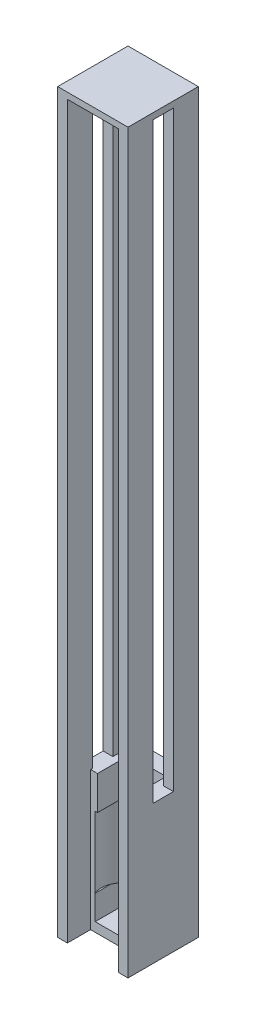
ISO-10303-21;
HEADER;
FILE_DESCRIPTION(('STEP AP214'),'2;1');
FILE_NAME('part.step','',(''),(''),'','','');
FILE_SCHEMA(('AUTOMOTIVE_DESIGN { 1 0 10303 214 1 1 1 1 }'));
ENDSEC;
DATA;
#1=APPLICATION_CONTEXT('core data for automotive mechanical design processes');
#2=APPLICATION_PROTOCOL_DEFINITION('international standard','automotive_design',2000,#1);
#3=PRODUCT_CONTEXT('',#1,'mechanical');
#4=PRODUCT('Part','Part','',(#3));
#5=PRODUCT_RELATED_PRODUCT_CATEGORY('part','',(#4));
#6=PRODUCT_DEFINITION_FORMATION('','',#4);
#7=PRODUCT_DEFINITION_CONTEXT('part definition',#1,'design');
#8=PRODUCT_DEFINITION('design','',#6,#7);
#9=PRODUCT_DEFINITION_SHAPE('','',#8);
#10=(LENGTH_UNIT() NAMED_UNIT(*) SI_UNIT(.MILLI.,.METRE.));
#11=(NAMED_UNIT(*) PLANE_ANGLE_UNIT() SI_UNIT($,.RADIAN.));
#12=(NAMED_UNIT(*) SI_UNIT($,.STERADIAN.) SOLID_ANGLE_UNIT());
#13=UNCERTAINTY_MEASURE_WITH_UNIT(LENGTH_MEASURE(1.E-05),#10,'distance_accuracy_value','');
#14=(GEOMETRIC_REPRESENTATION_CONTEXT(3) GLOBAL_UNCERTAINTY_ASSIGNED_CONTEXT((#13)) GLOBAL_UNIT_ASSIGNED_CONTEXT((#10,
#11,#12)) REPRESENTATION_CONTEXT('',''));
#15=CARTESIAN_POINT('',(0.,0.,0.));
#16=DIRECTION('',(0.,0.,1.));
#17=DIRECTION('',(1.,0.,0.));
#18=AXIS2_PLACEMENT_3D('',#15,#16,#17);
#19=CARTESIAN_POINT('',(0.,-11.5,1.5));
#20=DIRECTION('',(0.,1.,0.));
#21=DIRECTION('',(0.,0.,1.));
#22=AXIS2_PLACEMENT_3D('',#19,#20,#21);
#23=PLANE('',#22);
#24=DIRECTION('',(0.,0.,1.));
#25=VECTOR('',#24,1.);
#26=CARTESIAN_POINT('',(-6.75,-11.5,1.5));
#27=LINE('',#26,#25);
#28=CARTESIAN_POINT('',(-6.75,-11.5,-1.14575131106459));
#29=VERTEX_POINT('',#28);
#30=CARTESIAN_POINT('',(-6.75,-11.5,3.89730132926593));
#31=VERTEX_POINT('',#30);
#32=EDGE_CURVE('E45',#29,#31,#27,.T.);
#33=ORIENTED_EDGE('',*,*,#32,.F.);
#34=CARTESIAN_POINT('',(0.,-11.5,1.5));
#35=DIRECTION('',(0.,1.,0.));
#36=DIRECTION('',(0.,0.,1.));
#37=AXIS2_PLACEMENT_3D('',#34,#35,#36);
#38=CIRCLE('',#37,7.25);
#39=CARTESIAN_POINT('',(-6.84218140191414,-11.5,3.89730132926593));
#40=VERTEX_POINT('',#39);
#41=EDGE_CURVE('E427',#29,#40,#38,.T.);
#42=ORIENTED_EDGE('',*,*,#41,.T.);
#43=DIRECTION('',(1.,0.,0.));
#44=VECTOR('',#43,1.);
#45=CARTESIAN_POINT('',(0.,-11.5,3.89730132926593));
#46=LINE('',#45,#44);
#47=EDGE_CURVE('E466',#40,#31,#46,.T.);
#48=ORIENTED_EDGE('',*,*,#47,.T.);
#49=EDGE_LOOP('',(#33,#42,#48));
#50=FACE_BOUND('',#49,.T.);
#51=ADVANCED_FACE('F37',(#50),#23,.T.);
#52=DIRECTION('',(-1.,0.,0.));
#53=VECTOR('',#52,1.);
#54=CARTESIAN_POINT('',(0.,-11.5,-5.25));
#55=LINE('',#54,#53);
#56=CARTESIAN_POINT('',(2.6457513110646,-11.5,-5.25));
#57=VERTEX_POINT('',#56);
#58=CARTESIAN_POINT('',(-2.6457513110646,-11.5,-5.25));
#59=VERTEX_POINT('',#58);
#60=EDGE_CURVE('E477',#57,#59,#55,.T.);
#61=ORIENTED_EDGE('',*,*,#60,.F.);
#62=EDGE_CURVE('E493',#57,#59,#38,.T.);
#63=ORIENTED_EDGE('',*,*,#62,.T.);
#64=EDGE_LOOP('',(#61,#63));
#65=FACE_BOUND('',#64,.T.);
#66=ADVANCED_FACE('F503',(#65),#23,.T.);
#67=CARTESIAN_POINT('',(0.,11.5,1.5));
#68=DIRECTION('',(0.,1.,0.));
#69=DIRECTION('',(0.,0.,1.));
#70=AXIS2_PLACEMENT_3D('',#67,#68,#69);
#71=PLANE('',#70);
#72=CARTESIAN_POINT('',(0.,11.5,1.5));
#73=DIRECTION('',(0.,1.,0.));
#74=DIRECTION('',(0.,0.,1.));
#75=AXIS2_PLACEMENT_3D('',#72,#73,#74);
#76=CIRCLE('',#75,7.25);
#77=CARTESIAN_POINT('',(-6.,11.5,-2.56970514902493));
#78=VERTEX_POINT('',#77);
#79=CARTESIAN_POINT('',(-6.84218140191414,11.5,3.89730132926593));
#80=VERTEX_POINT('',#79);
#81=EDGE_CURVE('E433',#78,#80,#76,.T.);
#82=ORIENTED_EDGE('',*,*,#81,.F.);
#83=DIRECTION('',(0.,0.,1.));
#84=VECTOR('',#83,1.);
#85=CARTESIAN_POINT('',(-6.,11.5,1.5));
#86=LINE('',#85,#84);
#87=CARTESIAN_POINT('',(-6.,11.5,3.89730132926593));
#88=VERTEX_POINT('',#87);
#89=EDGE_CURVE('E472',#78,#88,#86,.T.);
#90=ORIENTED_EDGE('',*,*,#89,.T.);
#91=DIRECTION('',(1.,0.,0.));
#92=VECTOR('',#91,1.);
#93=CARTESIAN_POINT('',(0.,11.5,3.89730132926593));
#94=LINE('',#93,#92);
#95=EDGE_CURVE('E419',#80,#88,#94,.T.);
#96=ORIENTED_EDGE('',*,*,#95,.F.);
#97=EDGE_LOOP('',(#82,#90,#96));
#98=FACE_BOUND('',#97,.T.);
#99=ADVANCED_FACE('F518',(#98),#71,.F.);
#100=CARTESIAN_POINT('',(0.,22.5,0.));
#101=DIRECTION('',(0.,-1.,0.));
#102=DIRECTION('',(0.,0.,-1.));
#103=AXIS2_PLACEMENT_3D('',#100,#101,#102);
#104=PLANE('',#103);
#105=DIRECTION('',(-1.,0.,0.));
#106=VECTOR('',#105,1.);
#107=CARTESIAN_POINT('',(8.2557279477394,22.5,3.89730132926593));
#108=LINE('',#107,#106);
#109=CARTESIAN_POINT('',(-6.,22.5,3.89730132926593));
#110=VERTEX_POINT('',#109);
#111=CARTESIAN_POINT('',(-8.2557279477394,22.5,3.89730132926593));
#112=VERTEX_POINT('',#111);
#113=EDGE_CURVE('E396',#110,#112,#108,.T.);
#114=ORIENTED_EDGE('',*,*,#113,.F.);
#115=DIRECTION('',(0.,0.,1.));
#116=VECTOR('',#115,1.);
#117=CARTESIAN_POINT('',(-6.,22.5,6.375));
#118=LINE('',#117,#116);
#119=CARTESIAN_POINT('',(-6.,22.5,-6.375));
#120=VERTEX_POINT('',#119);
#121=EDGE_CURVE('E278',#120,#110,#118,.T.);
#122=ORIENTED_EDGE('',*,*,#121,.F.);
#123=DIRECTION('',(-1.,0.,0.));
#124=VECTOR('',#123,1.);
#125=CARTESIAN_POINT('',(6.,22.5,-6.375));
#126=LINE('',#125,#124);
#127=CARTESIAN_POINT('',(6.,22.5,-6.375));
#128=VERTEX_POINT('',#127);
#129=EDGE_CURVE('E281',#128,#120,#126,.T.);
#130=ORIENTED_EDGE('',*,*,#129,.F.);
#131=DIRECTION('',(0.,0.,-1.));
#132=VECTOR('',#131,1.);
#133=CARTESIAN_POINT('',(6.,22.5,6.375));
#134=LINE('',#133,#132);
#135=CARTESIAN_POINT('',(6.,22.5,3.89730132926593));
#136=VERTEX_POINT('',#135);
#137=EDGE_CURVE('E276',#136,#128,#134,.T.);
#138=ORIENTED_EDGE('',*,*,#137,.F.);
#139=CARTESIAN_POINT('',(8.2557279477394,22.5,3.89730132926593));
#140=VERTEX_POINT('',#139);
#141=EDGE_CURVE('E397',#140,#136,#108,.T.);
#142=ORIENTED_EDGE('',*,*,#141,.F.);
#143=DIRECTION('',(0.,0.,1.));
#144=VECTOR('',#143,1.);
#145=CARTESIAN_POINT('',(8.2557279477394,22.5,3.33955485981504));
#146=LINE('',#145,#144);
#147=CARTESIAN_POINT('',(8.2557279477394,22.5,3.33955485981504));
#148=VERTEX_POINT('',#147);
#149=EDGE_CURVE('E327',#148,#140,#146,.T.);
#150=ORIENTED_EDGE('',*,*,#149,.F.);
#151=DIRECTION('',(-1.,0.,0.));
#152=VECTOR('',#151,1.);
#153=CARTESIAN_POINT('',(8.2557279477394,22.5,3.33955485981504));
#154=LINE('',#153,#152);
#155=CARTESIAN_POINT('',(11.3973013292659,22.5,3.33955485981504));
#156=VERTEX_POINT('',#155);
#157=EDGE_CURVE('E330',#156,#148,#154,.T.);
#158=ORIENTED_EDGE('',*,*,#157,.F.);
#159=DIRECTION('',(0.,0.,-1.));
#160=VECTOR('',#159,1.);
#161=CARTESIAN_POINT('',(11.3973013292659,22.5,11.3973013292659));
#162=LINE('',#161,#160);
#163=CARTESIAN_POINT('',(11.3973013292659,22.5,-3.33955485981504));
#164=VERTEX_POINT('',#163);
#165=EDGE_CURVE('E443',#156,#164,#162,.T.);
#166=ORIENTED_EDGE('',*,*,#165,.T.);
#167=DIRECTION('',(1.,0.,0.));
#168=VECTOR('',#167,1.);
#169=CARTESIAN_POINT('',(8.2557279477394,22.5,-3.33955485981504));
#170=LINE('',#169,#168);
#171=CARTESIAN_POINT('',(8.2557279477394,22.5,-3.33955485981504));
#172=VERTEX_POINT('',#171);
#173=EDGE_CURVE('E364',#172,#164,#170,.T.);
#174=ORIENTED_EDGE('',*,*,#173,.F.);
#175=DIRECTION('',(0.,0.,1.));
#176=VECTOR('',#175,1.);
#177=CARTESIAN_POINT('',(8.2557279477394,22.5,-11.3973013292659));
#178=LINE('',#177,#176);
#179=CARTESIAN_POINT('',(8.2557279477394,22.5,-11.3973013292659));
#180=VERTEX_POINT('',#179);
#181=EDGE_CURVE('E367',#180,#172,#178,.T.);
#182=ORIENTED_EDGE('',*,*,#181,.F.);
#183=DIRECTION('',(-1.,0.,0.));
#184=VECTOR('',#183,1.);
#185=CARTESIAN_POINT('',(11.3973013292659,22.5,-11.3973013292659));
#186=LINE('',#185,#184);
#187=CARTESIAN_POINT('',(-8.2557279477394,22.5,-11.3973013292659));
#188=VERTEX_POINT('',#187);
#189=EDGE_CURVE('E440',#180,#188,#186,.T.);
#190=ORIENTED_EDGE('',*,*,#189,.T.);
#191=DIRECTION('',(0.,0.,-1.));
#192=VECTOR('',#191,1.);
#193=CARTESIAN_POINT('',(-8.2557279477394,22.5,-11.3973013292659));
#194=LINE('',#193,#192);
#195=CARTESIAN_POINT('',(-8.2557279477394,22.5,-3.33955485981504));
#196=VERTEX_POINT('',#195);
#197=EDGE_CURVE('E380',#196,#188,#194,.T.);
#198=ORIENTED_EDGE('',*,*,#197,.F.);
#199=DIRECTION('',(1.,0.,0.));
#200=VECTOR('',#199,1.);
#201=CARTESIAN_POINT('',(-8.2557279477394,22.5,-3.33955485981504));
#202=LINE('',#201,#200);
#203=CARTESIAN_POINT('',(-11.3973013292659,22.5,-3.33955485981504));
#204=VERTEX_POINT('',#203);
#205=EDGE_CURVE('E371',#204,#196,#202,.T.);
#206=ORIENTED_EDGE('',*,*,#205,.F.);
#207=DIRECTION('',(0.,0.,-1.));
#208=VECTOR('',#207,1.);
#209=CARTESIAN_POINT('',(-11.3973013292659,22.5,11.3973013292659));
#210=LINE('',#209,#208);
#211=CARTESIAN_POINT('',(-11.3973013292659,22.5,3.33955485981504));
#212=VERTEX_POINT('',#211);
#213=EDGE_CURVE('E438',#212,#204,#210,.T.);
#214=ORIENTED_EDGE('',*,*,#213,.F.);
#215=DIRECTION('',(-1.,0.,0.));
#216=VECTOR('',#215,1.);
#217=CARTESIAN_POINT('',(-8.2557279477394,22.5,3.33955485981504));
#218=LINE('',#217,#216);
#219=CARTESIAN_POINT('',(-8.2557279477394,22.5,3.33955485981504));
#220=VERTEX_POINT('',#219);
#221=EDGE_CURVE('E345',#220,#212,#218,.T.);
#222=ORIENTED_EDGE('',*,*,#221,.F.);
#223=DIRECTION('',(0.,0.,-1.));
#224=VECTOR('',#223,1.);
#225=CARTESIAN_POINT('',(-8.2557279477394,22.5,3.33955485981504));
#226=LINE('',#225,#224);
#227=EDGE_CURVE('E347',#112,#220,#226,.T.);
#228=ORIENTED_EDGE('',*,*,#227,.F.);
#229=EDGE_LOOP('',(#114,#122,#130,#138,#142,#150,#158,#166,#174,#182,#190,#198,#206,#214,#222,#228));
#230=FACE_BOUND('',#229,.T.);
#231=ADVANCED_FACE('F547',(#230),#104,.F.);
#232=CARTESIAN_POINT('',(0.,-22.5,0.));
#233=DIRECTION('',(0.,-1.,0.));
#234=DIRECTION('',(0.,0.,-1.));
#235=AXIS2_PLACEMENT_3D('',#232,#233,#234);
#236=PLANE('',#235);
#237=DIRECTION('',(-1.,0.,0.));
#238=VECTOR('',#237,1.);
#239=CARTESIAN_POINT('',(11.3973013292659,-22.5,11.3973013292659));
#240=LINE('',#239,#238);
#241=CARTESIAN_POINT('',(11.3973013292659,-22.5,11.3973013292659));
#242=VERTEX_POINT('',#241);
#243=CARTESIAN_POINT('',(8.2557279477394,-22.5,11.3973013292659));
#244=VERTEX_POINT('',#243);
#245=EDGE_CURVE('E446',#242,#244,#240,.T.);
#246=ORIENTED_EDGE('',*,*,#245,.T.);
#247=DIRECTION('',(0.,0.,1.));
#248=VECTOR('',#247,1.);
#249=CARTESIAN_POINT('',(8.2557279477394,-22.5,3.89730132926593));
#250=LINE('',#249,#248);
#251=CARTESIAN_POINT('',(8.2557279477394,-22.5,3.89730132926593));
#252=VERTEX_POINT('',#251);
#253=EDGE_CURVE('E408',#252,#244,#250,.T.);
#254=ORIENTED_EDGE('',*,*,#253,.F.);
#255=DIRECTION('',(-1.,0.,0.));
#256=VECTOR('',#255,1.);
#257=CARTESIAN_POINT('',(8.2557279477394,-22.5,3.89730132926593));
#258=LINE('',#257,#256);
#259=CARTESIAN_POINT('',(-8.2557279477394,-22.5,3.89730132926593));
#260=VERTEX_POINT('',#259);
#261=EDGE_CURVE('E402',#252,#260,#258,.T.);
#262=ORIENTED_EDGE('',*,*,#261,.T.);
#263=DIRECTION('',(0.,0.,1.));
#264=VECTOR('',#263,1.);
#265=CARTESIAN_POINT('',(-8.2557279477394,-22.5,3.89730132926593));
#266=LINE('',#265,#264);
#267=CARTESIAN_POINT('',(-8.2557279477394,-22.5,11.3973013292659));
#268=VERTEX_POINT('',#267);
#269=EDGE_CURVE('E407',#260,#268,#266,.T.);
#270=ORIENTED_EDGE('',*,*,#269,.T.);
#271=CARTESIAN_POINT('',(-11.3973013292659,-22.5,11.3973013292659));
#272=VERTEX_POINT('',#271);
#273=EDGE_CURVE('E431',#268,#272,#240,.T.);
#274=ORIENTED_EDGE('',*,*,#273,.T.);
#275=DIRECTION('',(0.,0.,-1.));
#276=VECTOR('',#275,1.);
#277=CARTESIAN_POINT('',(-11.3973013292659,-22.5,11.3973013292659));
#278=LINE('',#277,#276);
#279=CARTESIAN_POINT('',(-11.3973013292659,-22.5,-11.3973013292659));
#280=VERTEX_POINT('',#279);
#281=EDGE_CURVE('E449',#272,#280,#278,.T.);
#282=ORIENTED_EDGE('',*,*,#281,.T.);
#283=DIRECTION('',(-1.,0.,0.));
#284=VECTOR('',#283,1.);
#285=CARTESIAN_POINT('',(11.3973013292659,-22.5,-11.3973013292659));
#286=LINE('',#285,#284);
#287=CARTESIAN_POINT('',(11.3973013292659,-22.5,-11.3973013292659));
#288=VERTEX_POINT('',#287);
#289=EDGE_CURVE('E452',#288,#280,#286,.T.);
#290=ORIENTED_EDGE('',*,*,#289,.F.);
#291=DIRECTION('',(0.,0.,-1.));
#292=VECTOR('',#291,1.);
#293=CARTESIAN_POINT('',(11.3973013292659,-22.5,11.3973013292659));
#294=LINE('',#293,#292);
#295=EDGE_CURVE('E441',#242,#288,#294,.T.);
#296=ORIENTED_EDGE('',*,*,#295,.F.);
#297=EDGE_LOOP('',(#246,#254,#262,#270,#274,#282,#290,#296));
#298=FACE_BOUND('',#297,.T.);
#299=ADVANCED_FACE('F592',(#298),#236,.T.);
#300=CARTESIAN_POINT('',(11.3973013292659,22.5,11.3973013292659));
#301=DIRECTION('',(0.,0.,1.));
#302=DIRECTION('',(1.,0.,0.));
#303=AXIS2_PLACEMENT_3D('',#300,#301,#302);
#304=PLANE('',#303);
#305=DIRECTION('',(0.,-1.,0.));
#306=VECTOR('',#305,1.);
#307=CARTESIAN_POINT('',(-8.2557279477394,22.5,11.3973013292659));
#308=LINE('',#307,#306);
#309=CARTESIAN_POINT('',(-8.2557279477394,214.5,11.3973013292659));
#310=VERTEX_POINT('',#309);
#311=EDGE_CURVE('E422',#310,#268,#308,.T.);
#312=ORIENTED_EDGE('',*,*,#311,.F.);
#313=DIRECTION('',(1.,0.,0.));
#314=VECTOR('',#313,1.);
#315=CARTESIAN_POINT('',(-11.3973013292659,214.5,11.3973013292659));
#316=LINE('',#315,#314);
#317=CARTESIAN_POINT('',(8.2557279477394,214.5,11.3973013292659));
#318=VERTEX_POINT('',#317);
#319=EDGE_CURVE('E313',#310,#318,#316,.T.);
#320=ORIENTED_EDGE('',*,*,#319,.T.);
#321=DIRECTION('',(0.,-1.,0.));
#322=VECTOR('',#321,1.);
#323=CARTESIAN_POINT('',(8.2557279477394,22.5,11.3973013292659));
#324=LINE('',#323,#322);
#325=EDGE_CURVE('E424',#318,#244,#324,.T.);
#326=ORIENTED_EDGE('',*,*,#325,.T.);
#327=ORIENTED_EDGE('',*,*,#245,.F.);
#328=DIRECTION('',(0.,-1.,0.));
#329=VECTOR('',#328,1.);
#330=CARTESIAN_POINT('',(11.3973013292659,22.5,11.3973013292659));
#331=LINE('',#330,#329);
#332=CARTESIAN_POINT('',(11.3973013292659,216.5,11.3973013292659));
#333=VERTEX_POINT('',#332);
#334=EDGE_CURVE('E456',#333,#242,#331,.T.);
#335=ORIENTED_EDGE('',*,*,#334,.F.);
#336=DIRECTION('',(1.,0.,0.));
#337=VECTOR('',#336,1.);
#338=CARTESIAN_POINT('',(-11.3973013292659,216.5,11.3973013292659));
#339=LINE('',#338,#337);
#340=CARTESIAN_POINT('',(-11.3973013292659,216.5,11.3973013292659));
#341=VERTEX_POINT('',#340);
#342=EDGE_CURVE('E300',#341,#333,#339,.T.);
#343=ORIENTED_EDGE('',*,*,#342,.F.);
#344=DIRECTION('',(0.,-1.,0.));
#345=VECTOR('',#344,1.);
#346=CARTESIAN_POINT('',(-11.3973013292659,22.5,11.3973013292659));
#347=LINE('',#346,#345);
#348=EDGE_CURVE('E445',#341,#272,#347,.T.);
#349=ORIENTED_EDGE('',*,*,#348,.T.);
#350=ORIENTED_EDGE('',*,*,#273,.F.);
#351=EDGE_LOOP('',(#312,#320,#326,#327,#335,#343,#349,#350));
#352=FACE_BOUND('',#351,.T.);
#353=ADVANCED_FACE('F39',(#352),#304,.T.);
#354=CARTESIAN_POINT('',(11.3973013292659,22.5,11.3973013292659));
#355=DIRECTION('',(-1.,0.,0.));
#356=DIRECTION('',(0.,0.,1.));
#357=AXIS2_PLACEMENT_3D('',#354,#355,#356);
#358=PLANE('',#357);
#359=DIRECTION('',(0.,-1.,0.));
#360=VECTOR('',#359,1.);
#361=CARTESIAN_POINT('',(11.3973013292659,22.5,-11.3973013292659));
#362=LINE('',#361,#360);
#363=CARTESIAN_POINT('',(11.3973013292659,216.5,-11.3973013292659));
#364=VERTEX_POINT('',#363);
#365=EDGE_CURVE('E459',#364,#288,#362,.T.);
#366=ORIENTED_EDGE('',*,*,#365,.F.);
#367=DIRECTION('',(0.,0.,-1.));
#368=VECTOR('',#367,1.);
#369=CARTESIAN_POINT('',(11.3973013292659,216.5,-11.3973013292659));
#370=LINE('',#369,#368);
#371=EDGE_CURVE('E304',#333,#364,#370,.T.);
#372=ORIENTED_EDGE('',*,*,#371,.F.);
#373=ORIENTED_EDGE('',*,*,#334,.T.);
#374=ORIENTED_EDGE('',*,*,#295,.T.);
#375=EDGE_LOOP('',(#366,#372,#373,#374));
#376=FACE_BOUND('',#375,.T.);
#377=DIRECTION('',(0.,0.,-1.));
#378=VECTOR('',#377,1.);
#379=CARTESIAN_POINT('',(11.3973013292659,214.5,-11.3973013292659));
#380=LINE('',#379,#378);
#381=CARTESIAN_POINT('',(11.3973013292659,214.5,3.33955485981504));
#382=VERTEX_POINT('',#381);
#383=CARTESIAN_POINT('',(11.3973013292659,214.5,-3.33955485981504));
#384=VERTEX_POINT('',#383);
#385=EDGE_CURVE('E316',#382,#384,#380,.T.);
#386=ORIENTED_EDGE('',*,*,#385,.T.);
#387=DIRECTION('',(0.,-1.,0.));
#388=VECTOR('',#387,1.);
#389=CARTESIAN_POINT('',(11.3973013292659,214.5,-3.33955485981504));
#390=LINE('',#389,#388);
#391=EDGE_CURVE('E357',#384,#164,#390,.T.);
#392=ORIENTED_EDGE('',*,*,#391,.T.);
#393=ORIENTED_EDGE('',*,*,#165,.F.);
#394=DIRECTION('',(0.,-1.,0.));
#395=VECTOR('',#394,1.);
#396=CARTESIAN_POINT('',(11.3973013292659,214.5,3.33955485981504));
#397=LINE('',#396,#395);
#398=EDGE_CURVE('E323',#382,#156,#397,.T.);
#399=ORIENTED_EDGE('',*,*,#398,.F.);
#400=EDGE_LOOP('',(#386,#392,#393,#399));
#401=FACE_BOUND('',#400,.T.);
#402=ADVANCED_FACE('F556',(#376,#401),#358,.F.);
#403=CARTESIAN_POINT('',(11.3973013292659,22.5,-11.3973013292659));
#404=DIRECTION('',(0.,0.,1.));
#405=DIRECTION('',(1.,0.,0.));
#406=AXIS2_PLACEMENT_3D('',#403,#404,#405);
#407=PLANE('',#406);
#408=DIRECTION('',(0.,-1.,0.));
#409=VECTOR('',#408,1.);
#410=CARTESIAN_POINT('',(-11.3973013292659,22.5,-11.3973013292659));
#411=LINE('',#410,#409);
#412=CARTESIAN_POINT('',(-11.3973013292659,216.5,-11.3973013292659));
#413=VERTEX_POINT('',#412);
#414=EDGE_CURVE('E462',#413,#280,#411,.T.);
#415=ORIENTED_EDGE('',*,*,#414,.F.);
#416=DIRECTION('',(-1.,0.,0.));
#417=VECTOR('',#416,1.);
#418=CARTESIAN_POINT('',(-11.3973013292659,216.5,-11.3973013292659));
#419=LINE('',#418,#417);
#420=EDGE_CURVE('E307',#364,#413,#419,.T.);
#421=ORIENTED_EDGE('',*,*,#420,.F.);
#422=ORIENTED_EDGE('',*,*,#365,.T.);
#423=ORIENTED_EDGE('',*,*,#289,.T.);
#424=EDGE_LOOP('',(#415,#421,#422,#423));
#425=FACE_BOUND('',#424,.T.);
#426=DIRECTION('',(-1.,0.,0.));
#427=VECTOR('',#426,1.);
#428=CARTESIAN_POINT('',(-11.3973013292659,214.5,-11.3973013292659));
#429=LINE('',#428,#427);
#430=CARTESIAN_POINT('',(8.2557279477394,214.5,-11.3973013292659));
#431=VERTEX_POINT('',#430);
#432=CARTESIAN_POINT('',(-8.2557279477394,214.5,-11.3973013292659));
#433=VERTEX_POINT('',#432);
#434=EDGE_CURVE('E301',#431,#433,#429,.T.);
#435=ORIENTED_EDGE('',*,*,#434,.T.);
#436=DIRECTION('',(0.,-1.,0.));
#437=VECTOR('',#436,1.);
#438=CARTESIAN_POINT('',(-8.2557279477394,214.5,-11.3973013292659));
#439=LINE('',#438,#437);
#440=EDGE_CURVE('E383',#433,#188,#439,.T.);
#441=ORIENTED_EDGE('',*,*,#440,.T.);
#442=ORIENTED_EDGE('',*,*,#189,.F.);
#443=DIRECTION('',(0.,-1.,0.));
#444=VECTOR('',#443,1.);
#445=CARTESIAN_POINT('',(8.2557279477394,214.5,-11.3973013292659));
#446=LINE('',#445,#444);
#447=EDGE_CURVE('E360',#431,#180,#446,.T.);
#448=ORIENTED_EDGE('',*,*,#447,.F.);
#449=EDGE_LOOP('',(#435,#441,#442,#448));
#450=FACE_BOUND('',#449,.T.);
#451=ADVANCED_FACE('F569',(#425,#450),#407,.F.);
#452=CARTESIAN_POINT('',(-11.3973013292659,22.5,11.3973013292659));
#453=DIRECTION('',(-1.,0.,0.));
#454=DIRECTION('',(0.,0.,1.));
#455=AXIS2_PLACEMENT_3D('',#452,#453,#454);
#456=PLANE('',#455);
#457=DIRECTION('',(0.,-1.,0.));
#458=VECTOR('',#457,1.);
#459=CARTESIAN_POINT('',(-11.3973013292659,214.5,-3.33955485981504));
#460=LINE('',#459,#458);
#461=CARTESIAN_POINT('',(-11.3973013292659,214.5,-3.33955485981504));
#462=VERTEX_POINT('',#461);
#463=EDGE_CURVE('E393',#462,#204,#460,.T.);
#464=ORIENTED_EDGE('',*,*,#463,.F.);
#465=DIRECTION('',(0.,0.,1.));
#466=VECTOR('',#465,1.);
#467=CARTESIAN_POINT('',(-11.3973013292659,214.5,-11.3973013292659));
#468=LINE('',#467,#466);
#469=CARTESIAN_POINT('',(-11.3973013292659,214.5,3.33955485981504));
#470=VERTEX_POINT('',#469);
#471=EDGE_CURVE('E296',#462,#470,#468,.T.);
#472=ORIENTED_EDGE('',*,*,#471,.T.);
#473=DIRECTION('',(0.,-1.,0.));
#474=VECTOR('',#473,1.);
#475=CARTESIAN_POINT('',(-11.3973013292659,214.5,3.33955485981504));
#476=LINE('',#475,#474);
#477=EDGE_CURVE('E341',#470,#212,#476,.T.);
#478=ORIENTED_EDGE('',*,*,#477,.T.);
#479=ORIENTED_EDGE('',*,*,#213,.T.);
#480=EDGE_LOOP('',(#464,#472,#478,#479));
#481=FACE_BOUND('',#480,.T.);
#482=ORIENTED_EDGE('',*,*,#281,.F.);
#483=ORIENTED_EDGE('',*,*,#348,.F.);
#484=DIRECTION('',(0.,0.,1.));
#485=VECTOR('',#484,1.);
#486=CARTESIAN_POINT('',(-11.3973013292659,216.5,-11.3973013292659));
#487=LINE('',#486,#485);
#488=EDGE_CURVE('E297',#413,#341,#487,.T.);
#489=ORIENTED_EDGE('',*,*,#488,.F.);
#490=ORIENTED_EDGE('',*,*,#414,.T.);
#491=EDGE_LOOP('',(#482,#483,#489,#490));
#492=FACE_BOUND('',#491,.T.);
#493=ADVANCED_FACE('F579',(#481,#492),#456,.T.);
#494=CARTESIAN_POINT('',(0.,0.,3.89730132926593));
#495=DIRECTION('',(0.,0.,1.));
#496=DIRECTION('',(1.,0.,0.));
#497=AXIS2_PLACEMENT_3D('',#494,#495,#496);
#498=PLANE('',#497);
#499=DIRECTION('',(0.,-1.,0.));
#500=VECTOR('',#499,1.);
#501=CARTESIAN_POINT('',(-6.75,0.,3.89730132926593));
#502=LINE('',#501,#500);
#503=CARTESIAN_POINT('',(-6.75,-19.5,3.89730132926593));
#504=VERTEX_POINT('',#503);
#505=EDGE_CURVE('E273',#31,#504,#502,.T.);
#506=ORIENTED_EDGE('',*,*,#505,.F.);
#507=ORIENTED_EDGE('',*,*,#47,.F.);
#508=DIRECTION('',(0.,-1.,0.));
#509=VECTOR('',#508,1.);
#510=CARTESIAN_POINT('',(-6.84218140191414,11.5,3.89730132926593));
#511=LINE('',#510,#509);
#512=EDGE_CURVE('E415',#80,#40,#511,.T.);
#513=ORIENTED_EDGE('',*,*,#512,.F.);
#514=ORIENTED_EDGE('',*,*,#95,.T.);
#515=DIRECTION('',(0.,-1.,0.));
#516=VECTOR('',#515,1.);
#517=CARTESIAN_POINT('',(-6.,0.,3.89730132926593));
#518=LINE('',#517,#516);
#519=EDGE_CURVE('E294',#110,#88,#518,.T.);
#520=ORIENTED_EDGE('',*,*,#519,.F.);
#521=ORIENTED_EDGE('',*,*,#113,.T.);
#522=DIRECTION('',(0.,-1.,0.));
#523=VECTOR('',#522,1.);
#524=CARTESIAN_POINT('',(-8.2557279477394,22.5,3.89730132926593));
#525=LINE('',#524,#523);
#526=EDGE_CURVE('E400',#112,#260,#525,.T.);
#527=ORIENTED_EDGE('',*,*,#526,.T.);
#528=ORIENTED_EDGE('',*,*,#261,.F.);
#529=DIRECTION('',(0.,-1.,0.));
#530=VECTOR('',#529,1.);
#531=CARTESIAN_POINT('',(8.2557279477394,22.5,3.89730132926593));
#532=LINE('',#531,#530);
#533=EDGE_CURVE('E405',#140,#252,#532,.T.);
#534=ORIENTED_EDGE('',*,*,#533,.F.);
#535=ORIENTED_EDGE('',*,*,#141,.T.);
#536=DIRECTION('',(0.,1.,0.));
#537=VECTOR('',#536,1.);
#538=CARTESIAN_POINT('',(6.,0.,3.89730132926593));
#539=LINE('',#538,#537);
#540=CARTESIAN_POINT('',(6.,11.5,3.89730132926593));
#541=VERTEX_POINT('',#540);
#542=EDGE_CURVE('E292',#541,#136,#539,.T.);
#543=ORIENTED_EDGE('',*,*,#542,.F.);
#544=CARTESIAN_POINT('',(6.84218140191414,11.5,3.89730132926593));
#545=VERTEX_POINT('',#544);
#546=EDGE_CURVE('E418',#541,#545,#94,.T.);
#547=ORIENTED_EDGE('',*,*,#546,.T.);
#548=DIRECTION('',(0.,-1.,0.));
#549=VECTOR('',#548,1.);
#550=CARTESIAN_POINT('',(6.84218140191414,11.5,3.89730132926593));
#551=LINE('',#550,#549);
#552=CARTESIAN_POINT('',(6.84218140191414,-11.5,3.89730132926593));
#553=VERTEX_POINT('',#552);
#554=EDGE_CURVE('E410',#553,#545,#551,.F.);
#555=ORIENTED_EDGE('',*,*,#554,.F.);
#556=CARTESIAN_POINT('',(6.75,-11.5,3.89730132926593));
#557=VERTEX_POINT('',#556);
#558=EDGE_CURVE('E458',#557,#553,#46,.T.);
#559=ORIENTED_EDGE('',*,*,#558,.F.);
#560=DIRECTION('',(0.,1.,0.));
#561=VECTOR('',#560,1.);
#562=CARTESIAN_POINT('',(6.75,0.,3.89730132926593));
#563=LINE('',#562,#561);
#564=CARTESIAN_POINT('',(6.75,-19.5,3.89730132926593));
#565=VERTEX_POINT('',#564);
#566=EDGE_CURVE('E52',#565,#557,#563,.T.);
#567=ORIENTED_EDGE('',*,*,#566,.F.);
#568=DIRECTION('',(1.,0.,0.));
#569=VECTOR('',#568,1.);
#570=CARTESIAN_POINT('',(0.,-19.5,3.89730132926593));
#571=LINE('',#570,#569);
#572=EDGE_CURVE('E11',#504,#565,#571,.T.);
#573=ORIENTED_EDGE('',*,*,#572,.F.);
#574=EDGE_LOOP('',(#506,#507,#513,#514,#520,#521,#527,#528,#534,#535,#543,#547,#555,#559,#567,#573));
#575=FACE_BOUND('',#574,.T.);
#576=ADVANCED_FACE('F488',(#575),#498,.T.);
#577=CARTESIAN_POINT('',(8.2557279477394,22.5,3.89730132926593));
#578=DIRECTION('',(-1.,0.,0.));
#579=DIRECTION('',(0.,0.,1.));
#580=AXIS2_PLACEMENT_3D('',#577,#578,#579);
#581=PLANE('',#580);
#582=ORIENTED_EDGE('',*,*,#325,.F.);
#583=DIRECTION('',(0.,0.,1.));
#584=VECTOR('',#583,1.);
#585=CARTESIAN_POINT('',(8.2557279477394,214.5,3.33955485981504));
#586=LINE('',#585,#584);
#587=CARTESIAN_POINT('',(8.2557279477394,214.5,3.33955485981504));
#588=VERTEX_POINT('',#587);
#589=EDGE_CURVE('E326',#588,#318,#586,.T.);
#590=ORIENTED_EDGE('',*,*,#589,.F.);
#591=DIRECTION('',(0.,-1.,0.));
#592=VECTOR('',#591,1.);
#593=CARTESIAN_POINT('',(8.2557279477394,214.5,3.33955485981504));
#594=LINE('',#593,#592);
#595=EDGE_CURVE('E310',#588,#148,#594,.T.);
#596=ORIENTED_EDGE('',*,*,#595,.T.);
#597=ORIENTED_EDGE('',*,*,#149,.T.);
#598=ORIENTED_EDGE('',*,*,#533,.T.);
#599=ORIENTED_EDGE('',*,*,#253,.T.);
#600=EDGE_LOOP('',(#582,#590,#596,#597,#598,#599));
#601=FACE_BOUND('',#600,.T.);
#602=ADVANCED_FACE('F519',(#601),#581,.T.);
#603=CARTESIAN_POINT('',(-8.2557279477394,22.5,3.89730132926593));
#604=DIRECTION('',(-1.,0.,0.));
#605=DIRECTION('',(0.,0.,1.));
#606=AXIS2_PLACEMENT_3D('',#603,#604,#605);
#607=PLANE('',#606);
#608=ORIENTED_EDGE('',*,*,#311,.T.);
#609=ORIENTED_EDGE('',*,*,#269,.F.);
#610=ORIENTED_EDGE('',*,*,#526,.F.);
#611=ORIENTED_EDGE('',*,*,#227,.T.);
#612=DIRECTION('',(0.,-1.,0.));
#613=VECTOR('',#612,1.);
#614=CARTESIAN_POINT('',(-8.2557279477394,214.5,3.33955485981504));
#615=LINE('',#614,#613);
#616=CARTESIAN_POINT('',(-8.2557279477394,214.5,3.33955485981504));
#617=VERTEX_POINT('',#616);
#618=EDGE_CURVE('E334',#617,#220,#615,.T.);
#619=ORIENTED_EDGE('',*,*,#618,.F.);
#620=DIRECTION('',(0.,0.,-1.));
#621=VECTOR('',#620,1.);
#622=CARTESIAN_POINT('',(-8.2557279477394,214.5,3.33955485981504));
#623=LINE('',#622,#621);
#624=EDGE_CURVE('E348',#310,#617,#623,.T.);
#625=ORIENTED_EDGE('',*,*,#624,.F.);
#626=EDGE_LOOP('',(#608,#609,#610,#611,#619,#625));
#627=FACE_BOUND('',#626,.T.);
#628=ADVANCED_FACE('F509',(#627),#607,.F.);
#629=CARTESIAN_POINT('',(0.,11.5,1.5));
#630=DIRECTION('',(0.,-1.,0.));
#631=DIRECTION('',(0.,0.,-1.));
#632=AXIS2_PLACEMENT_3D('',#629,#630,#631);
#633=CYLINDRICAL_SURFACE('',#632,7.25);
#634=CARTESIAN_POINT('',(6.,11.5,-2.56970514902492));
#635=VERTEX_POINT('',#634);
#636=EDGE_CURVE('E428',#545,#635,#76,.T.);
#637=ORIENTED_EDGE('',*,*,#636,.T.);
#638=EDGE_CURVE('E432',#635,#78,#76,.T.);
#639=ORIENTED_EDGE('',*,*,#638,.T.);
#640=ORIENTED_EDGE('',*,*,#81,.T.);
#641=ORIENTED_EDGE('',*,*,#512,.T.);
#642=ORIENTED_EDGE('',*,*,#41,.F.);
#643=EDGE_CURVE('E492',#59,#29,#38,.T.);
#644=ORIENTED_EDGE('',*,*,#643,.F.);
#645=ORIENTED_EDGE('',*,*,#62,.F.);
#646=CARTESIAN_POINT('',(6.75,-11.5,-1.14575131106459));
#647=VERTEX_POINT('',#646);
#648=EDGE_CURVE('E437',#647,#57,#38,.T.);
#649=ORIENTED_EDGE('',*,*,#648,.F.);
#650=EDGE_CURVE('E434',#553,#647,#38,.T.);
#651=ORIENTED_EDGE('',*,*,#650,.F.);
#652=ORIENTED_EDGE('',*,*,#554,.T.);
#653=EDGE_LOOP('',(#637,#639,#640,#641,#642,#644,#645,#649,#651,#652));
#654=FACE_BOUND('',#653,.T.);
#655=ADVANCED_FACE('F504',(#654),#633,.F.);
#656=ORIENTED_EDGE('',*,*,#546,.F.);
#657=DIRECTION('',(0.,0.,-1.));
#658=VECTOR('',#657,1.);
#659=CARTESIAN_POINT('',(6.,11.5,1.5));
#660=LINE('',#659,#658);
#661=EDGE_CURVE('E469',#541,#635,#660,.T.);
#662=ORIENTED_EDGE('',*,*,#661,.T.);
#663=ORIENTED_EDGE('',*,*,#636,.F.);
#664=EDGE_LOOP('',(#656,#662,#663));
#665=FACE_BOUND('',#664,.T.);
#666=ADVANCED_FACE('F508',(#665),#71,.F.);
#667=DIRECTION('',(0.,0.,-1.));
#668=VECTOR('',#667,1.);
#669=CARTESIAN_POINT('',(6.75,-11.5,1.5));
#670=LINE('',#669,#668);
#671=EDGE_CURVE('E475',#557,#647,#670,.T.);
#672=ORIENTED_EDGE('',*,*,#671,.F.);
#673=ORIENTED_EDGE('',*,*,#558,.T.);
#674=ORIENTED_EDGE('',*,*,#650,.T.);
#675=EDGE_LOOP('',(#672,#673,#674));
#676=FACE_BOUND('',#675,.T.);
#677=ADVANCED_FACE('F515',(#676),#23,.T.);
#678=CARTESIAN_POINT('',(-8.2557279477394,214.5,-3.33955485981504));
#679=DIRECTION('',(0.,0.,-1.));
#680=DIRECTION('',(-1.,0.,0.));
#681=AXIS2_PLACEMENT_3D('',#678,#679,#680);
#682=PLANE('',#681);
#683=ORIENTED_EDGE('',*,*,#205,.T.);
#684=DIRECTION('',(0.,-1.,0.));
#685=VECTOR('',#684,1.);
#686=CARTESIAN_POINT('',(-8.2557279477394,214.5,-3.33955485981504));
#687=LINE('',#686,#685);
#688=CARTESIAN_POINT('',(-8.2557279477394,214.5,-3.33955485981504));
#689=VERTEX_POINT('',#688);
#690=EDGE_CURVE('E390',#689,#196,#687,.T.);
#691=ORIENTED_EDGE('',*,*,#690,.F.);
#692=DIRECTION('',(1.,0.,0.));
#693=VECTOR('',#692,1.);
#694=CARTESIAN_POINT('',(-8.2557279477394,214.5,-3.33955485981504));
#695=LINE('',#694,#693);
#696=EDGE_CURVE('E376',#462,#689,#695,.T.);
#697=ORIENTED_EDGE('',*,*,#696,.F.);
#698=ORIENTED_EDGE('',*,*,#463,.T.);
#699=EDGE_LOOP('',(#683,#691,#697,#698));
#700=FACE_BOUND('',#699,.T.);
#701=ADVANCED_FACE('F529',(#700),#682,.F.);
#702=CARTESIAN_POINT('',(-8.2557279477394,214.5,-11.3973013292659));
#703=DIRECTION('',(-1.,0.,0.));
#704=DIRECTION('',(0.,0.,1.));
#705=AXIS2_PLACEMENT_3D('',#702,#703,#704);
#706=PLANE('',#705);
#707=ORIENTED_EDGE('',*,*,#197,.T.);
#708=ORIENTED_EDGE('',*,*,#440,.F.);
#709=DIRECTION('',(0.,0.,-1.));
#710=VECTOR('',#709,1.);
#711=CARTESIAN_POINT('',(-8.2557279477394,214.5,-11.3973013292659));
#712=LINE('',#711,#710);
#713=EDGE_CURVE('E379',#689,#433,#712,.T.);
#714=ORIENTED_EDGE('',*,*,#713,.F.);
#715=ORIENTED_EDGE('',*,*,#690,.T.);
#716=EDGE_LOOP('',(#707,#708,#714,#715));
#717=FACE_BOUND('',#716,.T.);
#718=ADVANCED_FACE('F534',(#717),#706,.F.);
#719=CARTESIAN_POINT('',(8.2557279477394,214.5,-11.3973013292659));
#720=DIRECTION('',(1.,0.,0.));
#721=DIRECTION('',(0.,0.,-1.));
#722=AXIS2_PLACEMENT_3D('',#719,#720,#721);
#723=PLANE('',#722);
#724=ORIENTED_EDGE('',*,*,#181,.T.);
#725=DIRECTION('',(0.,-1.,0.));
#726=VECTOR('',#725,1.);
#727=CARTESIAN_POINT('',(8.2557279477394,214.5,-3.33955485981504));
#728=LINE('',#727,#726);
#729=CARTESIAN_POINT('',(8.2557279477394,214.5,-3.33955485981504));
#730=VERTEX_POINT('',#729);
#731=EDGE_CURVE('E350',#730,#172,#728,.T.);
#732=ORIENTED_EDGE('',*,*,#731,.F.);
#733=DIRECTION('',(0.,0.,1.));
#734=VECTOR('',#733,1.);
#735=CARTESIAN_POINT('',(8.2557279477394,214.5,-11.3973013292659));
#736=LINE('',#735,#734);
#737=EDGE_CURVE('E368',#431,#730,#736,.T.);
#738=ORIENTED_EDGE('',*,*,#737,.F.);
#739=ORIENTED_EDGE('',*,*,#447,.T.);
#740=EDGE_LOOP('',(#724,#732,#738,#739));
#741=FACE_BOUND('',#740,.T.);
#742=ADVANCED_FACE('F567',(#741),#723,.F.);
#743=CARTESIAN_POINT('',(8.2557279477394,214.5,-3.33955485981504));
#744=DIRECTION('',(0.,0.,-1.));
#745=DIRECTION('',(-1.,0.,0.));
#746=AXIS2_PLACEMENT_3D('',#743,#744,#745);
#747=PLANE('',#746);
#748=ORIENTED_EDGE('',*,*,#173,.T.);
#749=ORIENTED_EDGE('',*,*,#391,.F.);
#750=DIRECTION('',(1.,0.,0.));
#751=VECTOR('',#750,1.);
#752=CARTESIAN_POINT('',(8.2557279477394,214.5,-3.33955485981504));
#753=LINE('',#752,#751);
#754=EDGE_CURVE('E363',#730,#384,#753,.T.);
#755=ORIENTED_EDGE('',*,*,#754,.F.);
#756=ORIENTED_EDGE('',*,*,#731,.T.);
#757=EDGE_LOOP('',(#748,#749,#755,#756));
#758=FACE_BOUND('',#757,.T.);
#759=ADVANCED_FACE('F559',(#758),#747,.F.);
#760=CARTESIAN_POINT('',(-8.2557279477394,214.5,3.33955485981504));
#761=DIRECTION('',(0.,0.,1.));
#762=DIRECTION('',(1.,0.,0.));
#763=AXIS2_PLACEMENT_3D('',#760,#761,#762);
#764=PLANE('',#763);
#765=ORIENTED_EDGE('',*,*,#221,.T.);
#766=ORIENTED_EDGE('',*,*,#477,.F.);
#767=DIRECTION('',(-1.,0.,0.));
#768=VECTOR('',#767,1.);
#769=CARTESIAN_POINT('',(-8.2557279477394,214.5,3.33955485981504));
#770=LINE('',#769,#768);
#771=EDGE_CURVE('E344',#617,#470,#770,.T.);
#772=ORIENTED_EDGE('',*,*,#771,.F.);
#773=ORIENTED_EDGE('',*,*,#618,.T.);
#774=EDGE_LOOP('',(#765,#766,#772,#773));
#775=FACE_BOUND('',#774,.T.);
#776=ADVANCED_FACE('F583',(#775),#764,.F.);
#777=CARTESIAN_POINT('',(8.2557279477394,214.5,3.33955485981504));
#778=DIRECTION('',(0.,0.,1.));
#779=DIRECTION('',(1.,0.,0.));
#780=AXIS2_PLACEMENT_3D('',#777,#778,#779);
#781=PLANE('',#780);
#782=ORIENTED_EDGE('',*,*,#157,.T.);
#783=ORIENTED_EDGE('',*,*,#595,.F.);
#784=DIRECTION('',(-1.,0.,0.));
#785=VECTOR('',#784,1.);
#786=CARTESIAN_POINT('',(8.2557279477394,214.5,3.33955485981504));
#787=LINE('',#786,#785);
#788=EDGE_CURVE('E331',#382,#588,#787,.T.);
#789=ORIENTED_EDGE('',*,*,#788,.F.);
#790=ORIENTED_EDGE('',*,*,#398,.T.);
#791=EDGE_LOOP('',(#782,#783,#789,#790));
#792=FACE_BOUND('',#791,.T.);
#793=ADVANCED_FACE('F552',(#792),#781,.F.);
#794=CARTESIAN_POINT('',(0.,214.5,0.));
#795=DIRECTION('',(0.,1.,0.));
#796=DIRECTION('',(0.,0.,1.));
#797=AXIS2_PLACEMENT_3D('',#794,#795,#796);
#798=PLANE('',#797);
#799=ORIENTED_EDGE('',*,*,#471,.F.);
#800=ORIENTED_EDGE('',*,*,#696,.T.);
#801=ORIENTED_EDGE('',*,*,#713,.T.);
#802=ORIENTED_EDGE('',*,*,#434,.F.);
#803=ORIENTED_EDGE('',*,*,#737,.T.);
#804=ORIENTED_EDGE('',*,*,#754,.T.);
#805=ORIENTED_EDGE('',*,*,#385,.F.);
#806=ORIENTED_EDGE('',*,*,#788,.T.);
#807=ORIENTED_EDGE('',*,*,#589,.T.);
#808=ORIENTED_EDGE('',*,*,#319,.F.);
#809=ORIENTED_EDGE('',*,*,#624,.T.);
#810=ORIENTED_EDGE('',*,*,#771,.T.);
#811=EDGE_LOOP('',(#799,#800,#801,#802,#803,#804,#805,#806,#807,#808,#809,#810));
#812=FACE_BOUND('',#811,.T.);
#813=ADVANCED_FACE('F563',(#812),#798,.F.);
#814=CARTESIAN_POINT('',(0.,216.5,0.));
#815=DIRECTION('',(0.,1.,0.));
#816=DIRECTION('',(0.,0.,1.));
#817=AXIS2_PLACEMENT_3D('',#814,#815,#816);
#818=PLANE('',#817);
#819=ORIENTED_EDGE('',*,*,#488,.T.);
#820=ORIENTED_EDGE('',*,*,#342,.T.);
#821=ORIENTED_EDGE('',*,*,#371,.T.);
#822=ORIENTED_EDGE('',*,*,#420,.T.);
#823=EDGE_LOOP('',(#819,#820,#821,#822));
#824=FACE_BOUND('',#823,.T.);
#825=ADVANCED_FACE('F632',(#824),#818,.T.);
#826=CARTESIAN_POINT('',(-6.,40.0089262948931,6.375));
#827=DIRECTION('',(-1.,0.,0.));
#828=DIRECTION('',(0.,0.,1.));
#829=AXIS2_PLACEMENT_3D('',#826,#827,#828);
#830=PLANE('',#829);
#831=ORIENTED_EDGE('',*,*,#519,.T.);
#832=ORIENTED_EDGE('',*,*,#89,.F.);
#833=DIRECTION('',(0.,0.,-1.));
#834=VECTOR('',#833,1.);
#835=CARTESIAN_POINT('',(-6.,11.5,6.375));
#836=LINE('',#835,#834);
#837=CARTESIAN_POINT('',(-6.,11.5,-6.375));
#838=VERTEX_POINT('',#837);
#839=EDGE_CURVE('E275',#78,#838,#836,.T.);
#840=ORIENTED_EDGE('',*,*,#839,.T.);
#841=DIRECTION('',(0.,-1.,0.));
#842=VECTOR('',#841,1.);
#843=CARTESIAN_POINT('',(-6.,40.0089262948931,-6.375));
#844=LINE('',#843,#842);
#845=EDGE_CURVE('E287',#120,#838,#844,.T.);
#846=ORIENTED_EDGE('',*,*,#845,.F.);
#847=ORIENTED_EDGE('',*,*,#121,.T.);
#848=EDGE_LOOP('',(#831,#832,#840,#846,#847));
#849=FACE_BOUND('',#848,.T.);
#850=ADVANCED_FACE('F600',(#849),#830,.F.);
#851=CARTESIAN_POINT('',(6.,40.0089262948931,6.375));
#852=DIRECTION('',(1.,0.,0.));
#853=DIRECTION('',(0.,0.,-1.));
#854=AXIS2_PLACEMENT_3D('',#851,#852,#853);
#855=PLANE('',#854);
#856=ORIENTED_EDGE('',*,*,#542,.T.);
#857=ORIENTED_EDGE('',*,*,#137,.T.);
#858=DIRECTION('',(0.,-1.,0.));
#859=VECTOR('',#858,1.);
#860=CARTESIAN_POINT('',(6.,40.0089262948931,-6.375));
#861=LINE('',#860,#859);
#862=CARTESIAN_POINT('',(6.,11.5,-6.375));
#863=VERTEX_POINT('',#862);
#864=EDGE_CURVE('E279',#128,#863,#861,.T.);
#865=ORIENTED_EDGE('',*,*,#864,.T.);
#866=DIRECTION('',(0.,0.,1.));
#867=VECTOR('',#866,1.);
#868=CARTESIAN_POINT('',(6.,11.5,6.375));
#869=LINE('',#868,#867);
#870=EDGE_CURVE('E60',#863,#635,#869,.T.);
#871=ORIENTED_EDGE('',*,*,#870,.T.);
#872=ORIENTED_EDGE('',*,*,#661,.F.);
#873=EDGE_LOOP('',(#856,#857,#865,#871,#872));
#874=FACE_BOUND('',#873,.T.);
#875=ADVANCED_FACE('F541',(#874),#855,.F.);
#876=CARTESIAN_POINT('',(6.,40.0089262948931,-6.375));
#877=DIRECTION('',(0.,0.,-1.));
#878=DIRECTION('',(-1.,0.,0.));
#879=AXIS2_PLACEMENT_3D('',#876,#877,#878);
#880=PLANE('',#879);
#881=ORIENTED_EDGE('',*,*,#129,.T.);
#882=ORIENTED_EDGE('',*,*,#845,.T.);
#883=DIRECTION('',(1.,0.,0.));
#884=VECTOR('',#883,1.);
#885=CARTESIAN_POINT('',(6.,11.5,-6.375));
#886=LINE('',#885,#884);
#887=EDGE_CURVE('E283',#838,#863,#886,.T.);
#888=ORIENTED_EDGE('',*,*,#887,.T.);
#889=ORIENTED_EDGE('',*,*,#864,.F.);
#890=EDGE_LOOP('',(#881,#882,#888,#889));
#891=FACE_BOUND('',#890,.T.);
#892=ADVANCED_FACE('F604',(#891),#880,.F.);
#893=CARTESIAN_POINT('',(0.,11.5,0.));
#894=DIRECTION('',(0.,1.,0.));
#895=DIRECTION('',(0.,0.,1.));
#896=AXIS2_PLACEMENT_3D('',#893,#894,#895);
#897=PLANE('',#896);
#898=ORIENTED_EDGE('',*,*,#870,.F.);
#899=ORIENTED_EDGE('',*,*,#887,.F.);
#900=ORIENTED_EDGE('',*,*,#839,.F.);
#901=ORIENTED_EDGE('',*,*,#638,.F.);
#902=EDGE_LOOP('',(#898,#899,#900,#901));
#903=FACE_BOUND('',#902,.T.);
#904=ADVANCED_FACE('F607',(#903),#897,.T.);
#905=CARTESIAN_POINT('',(0.,-11.5,0.));
#906=DIRECTION('',(0.,-1.,0.));
#907=DIRECTION('',(0.,0.,-1.));
#908=AXIS2_PLACEMENT_3D('',#905,#906,#907);
#909=PLANE('',#908);
#910=DIRECTION('',(-1.,0.,0.));
#911=VECTOR('',#910,1.);
#912=CARTESIAN_POINT('',(6.75,-11.5,-5.25));
#913=LINE('',#912,#911);
#914=CARTESIAN_POINT('',(6.75,-11.5,-5.25));
#915=VERTEX_POINT('',#914);
#916=EDGE_CURVE('E269',#915,#57,#913,.T.);
#917=ORIENTED_EDGE('',*,*,#916,.F.);
#918=DIRECTION('',(0.,0.,-1.));
#919=VECTOR('',#918,1.);
#920=CARTESIAN_POINT('',(6.75,-11.5,-5.25));
#921=LINE('',#920,#919);
#922=EDGE_CURVE('E252',#647,#915,#921,.T.);
#923=ORIENTED_EDGE('',*,*,#922,.F.);
#924=ORIENTED_EDGE('',*,*,#648,.T.);
#925=EDGE_LOOP('',(#917,#923,#924));
#926=FACE_BOUND('',#925,.T.);
#927=ADVANCED_FACE('F501',(#926),#909,.T.);
#928=CARTESIAN_POINT('',(-6.75,-19.5,-5.25));
#929=DIRECTION('',(-1.,0.,0.));
#930=DIRECTION('',(0.,0.,1.));
#931=AXIS2_PLACEMENT_3D('',#928,#929,#930);
#932=PLANE('',#931);
#933=ORIENTED_EDGE('',*,*,#505,.T.);
#934=DIRECTION('',(0.,0.,1.));
#935=VECTOR('',#934,1.);
#936=CARTESIAN_POINT('',(-6.75,-19.5,-5.25));
#937=LINE('',#936,#935);
#938=CARTESIAN_POINT('',(-6.75,-19.5,-5.25));
#939=VERTEX_POINT('',#938);
#940=EDGE_CURVE('E247',#939,#504,#937,.T.);
#941=ORIENTED_EDGE('',*,*,#940,.F.);
#942=DIRECTION('',(0.,1.,0.));
#943=VECTOR('',#942,1.);
#944=CARTESIAN_POINT('',(-6.75,-19.5,-5.25));
#945=LINE('',#944,#943);
#946=CARTESIAN_POINT('',(-6.75,-11.5,-5.25));
#947=VERTEX_POINT('',#946);
#948=EDGE_CURVE('E256',#939,#947,#945,.T.);
#949=ORIENTED_EDGE('',*,*,#948,.T.);
#950=DIRECTION('',(0.,0.,1.));
#951=VECTOR('',#950,1.);
#952=CARTESIAN_POINT('',(-6.75,-11.5,-5.25));
#953=LINE('',#952,#951);
#954=EDGE_CURVE('E264',#947,#29,#953,.T.);
#955=ORIENTED_EDGE('',*,*,#954,.T.);
#956=ORIENTED_EDGE('',*,*,#32,.T.);
#957=EDGE_LOOP('',(#933,#941,#949,#955,#956));
#958=FACE_BOUND('',#957,.T.);
#959=ADVANCED_FACE('F482',(#958),#932,.F.);
#960=CARTESIAN_POINT('',(6.75,-19.5,-5.25));
#961=DIRECTION('',(0.,0.,-1.));
#962=DIRECTION('',(-1.,0.,0.));
#963=AXIS2_PLACEMENT_3D('',#960,#961,#962);
#964=PLANE('',#963);
#965=ORIENTED_EDGE('',*,*,#916,.T.);
#966=ORIENTED_EDGE('',*,*,#60,.T.);
#967=EDGE_CURVE('E268',#59,#947,#913,.T.);
#968=ORIENTED_EDGE('',*,*,#967,.T.);
#969=ORIENTED_EDGE('',*,*,#948,.F.);
#970=DIRECTION('',(-1.,0.,0.));
#971=VECTOR('',#970,1.);
#972=CARTESIAN_POINT('',(6.75,-19.5,-5.25));
#973=LINE('',#972,#971);
#974=CARTESIAN_POINT('',(6.75,-19.5,-5.25));
#975=VERTEX_POINT('',#974);
#976=EDGE_CURVE('E245',#975,#939,#973,.T.);
#977=ORIENTED_EDGE('',*,*,#976,.F.);
#978=DIRECTION('',(0.,1.,0.));
#979=VECTOR('',#978,1.);
#980=CARTESIAN_POINT('',(6.75,-19.5,-5.25));
#981=LINE('',#980,#979);
#982=EDGE_CURVE('E250',#975,#915,#981,.T.);
#983=ORIENTED_EDGE('',*,*,#982,.T.);
#984=EDGE_LOOP('',(#965,#966,#968,#969,#977,#983));
#985=FACE_BOUND('',#984,.T.);
#986=ADVANCED_FACE('F258',(#985),#964,.F.);
#987=CARTESIAN_POINT('',(6.75,-19.5,-5.25));
#988=DIRECTION('',(1.,0.,0.));
#989=DIRECTION('',(0.,0.,-1.));
#990=AXIS2_PLACEMENT_3D('',#987,#988,#989);
#991=PLANE('',#990);
#992=ORIENTED_EDGE('',*,*,#566,.T.);
#993=ORIENTED_EDGE('',*,*,#671,.T.);
#994=ORIENTED_EDGE('',*,*,#922,.T.);
#995=ORIENTED_EDGE('',*,*,#982,.F.);
#996=DIRECTION('',(0.,0.,-1.));
#997=VECTOR('',#996,1.);
#998=CARTESIAN_POINT('',(6.75,-19.5,-5.25));
#999=LINE('',#998,#997);
#1000=EDGE_CURVE('E240',#565,#975,#999,.T.);
#1001=ORIENTED_EDGE('',*,*,#1000,.F.);
#1002=EDGE_LOOP('',(#992,#993,#994,#995,#1001));
#1003=FACE_BOUND('',#1002,.T.);
#1004=ADVANCED_FACE('F251',(#1003),#991,.F.);
#1005=CARTESIAN_POINT('',(0.,-19.5,0.));
#1006=DIRECTION('',(0.,-1.,0.));
#1007=DIRECTION('',(0.,0.,-1.));
#1008=AXIS2_PLACEMENT_3D('',#1005,#1006,#1007);
#1009=PLANE('',#1008);
#1010=ORIENTED_EDGE('',*,*,#572,.T.);
#1011=ORIENTED_EDGE('',*,*,#1000,.T.);
#1012=ORIENTED_EDGE('',*,*,#976,.T.);
#1013=ORIENTED_EDGE('',*,*,#940,.T.);
#1014=EDGE_LOOP('',(#1010,#1011,#1012,#1013));
#1015=FACE_BOUND('',#1014,.T.);
#1016=ADVANCED_FACE('F242',(#1015),#1009,.F.);
#1017=ORIENTED_EDGE('',*,*,#954,.F.);
#1018=ORIENTED_EDGE('',*,*,#967,.F.);
#1019=ORIENTED_EDGE('',*,*,#643,.T.);
#1020=EDGE_LOOP('',(#1017,#1018,#1019));
#1021=FACE_BOUND('',#1020,.T.);
#1022=ADVANCED_FACE('F650',(#1021),#909,.T.);
#1023=CLOSED_SHELL('',(#51,#66,#99,#231,#299,#353,#402,#451,#493,#576,#602,#628,#655,#666,#677,
#701,#718,#742,#759,#776,#793,#813,#825,#850,#875,#892,#904,#927,#959,#986,#1004,#1016,#1022));
#1024=MANIFOLD_SOLID_BREP('B2',#1023);
#1025=ADVANCED_BREP_SHAPE_REPRESENTATION('',(#18,#1024),#14);
#1026=SHAPE_DEFINITION_REPRESENTATION(#9,#1025);
ENDSEC;
END-ISO-10303-21;
